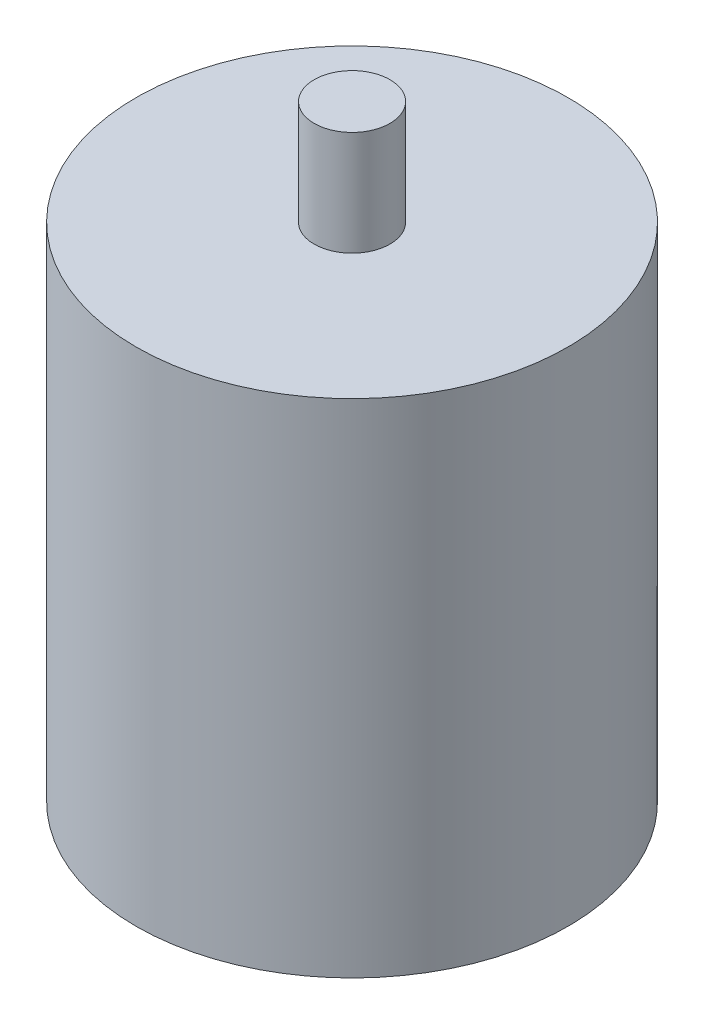
ISO-10303-21;
HEADER;
FILE_DESCRIPTION(('STEP AP214'),'2;1');
FILE_NAME('part.step','',(''),(''),'','','');
FILE_SCHEMA(('AUTOMOTIVE_DESIGN { 1 0 10303 214 1 1 1 1 }'));
ENDSEC;
DATA;
#1=APPLICATION_CONTEXT('core data for automotive mechanical design processes');
#2=APPLICATION_PROTOCOL_DEFINITION('international standard','automotive_design',2000,#1);
#3=PRODUCT_CONTEXT('',#1,'mechanical');
#4=PRODUCT('Part','Part','',(#3));
#5=PRODUCT_RELATED_PRODUCT_CATEGORY('part','',(#4));
#6=PRODUCT_DEFINITION_FORMATION('','',#4);
#7=PRODUCT_DEFINITION_CONTEXT('part definition',#1,'design');
#8=PRODUCT_DEFINITION('design','',#6,#7);
#9=PRODUCT_DEFINITION_SHAPE('','',#8);
#10=(LENGTH_UNIT() NAMED_UNIT(*) SI_UNIT(.MILLI.,.METRE.));
#11=(NAMED_UNIT(*) PLANE_ANGLE_UNIT() SI_UNIT($,.RADIAN.));
#12=(NAMED_UNIT(*) SI_UNIT($,.STERADIAN.) SOLID_ANGLE_UNIT());
#13=UNCERTAINTY_MEASURE_WITH_UNIT(LENGTH_MEASURE(1.E-05),#10,'distance_accuracy_value','');
#14=(GEOMETRIC_REPRESENTATION_CONTEXT(3) GLOBAL_UNCERTAINTY_ASSIGNED_CONTEXT((#13)) GLOBAL_UNIT_ASSIGNED_CONTEXT((#10,
#11,#12)) REPRESENTATION_CONTEXT('',''));
#15=CARTESIAN_POINT('',(0.,0.,0.));
#16=DIRECTION('',(0.,0.,1.));
#17=DIRECTION('',(1.,0.,0.));
#18=AXIS2_PLACEMENT_3D('',#15,#16,#17);
#19=CARTESIAN_POINT('',(0.,33.1,0.));
#20=DIRECTION('',(0.,-1.,0.));
#21=DIRECTION('',(0.,0.,-1.));
#22=AXIS2_PLACEMENT_3D('',#19,#20,#21);
#23=CYLINDRICAL_SURFACE('',#22,14.25);
#24=CARTESIAN_POINT('',(0.,33.1,0.));
#25=DIRECTION('',(0.,1.,0.));
#26=DIRECTION('',(0.,0.,1.));
#27=AXIS2_PLACEMENT_3D('',#24,#25,#26);
#28=CIRCLE('',#27,14.25);
#29=CARTESIAN_POINT('',(0.,33.1,14.25));
#30=VERTEX_POINT('',#29);
#31=EDGE_CURVE('E10',#30,#30,#28,.T.);
#32=ORIENTED_EDGE('',*,*,#31,.F.);
#33=EDGE_LOOP('',(#32));
#34=FACE_BOUND('',#33,.T.);
#35=CARTESIAN_POINT('',(0.,0.,0.));
#36=DIRECTION('',(0.,1.,0.));
#37=DIRECTION('',(0.,0.,1.));
#38=AXIS2_PLACEMENT_3D('',#35,#36,#37);
#39=CIRCLE('',#38,14.25);
#40=CARTESIAN_POINT('',(0.,0.,14.25));
#41=VERTEX_POINT('',#40);
#42=EDGE_CURVE('E37',#41,#41,#39,.T.);
#43=ORIENTED_EDGE('',*,*,#42,.T.);
#44=EDGE_LOOP('',(#43));
#45=FACE_BOUND('',#44,.T.);
#46=ADVANCED_FACE('F40',(#34,#45),#23,.T.);
#47=CARTESIAN_POINT('',(0.,33.1,0.));
#48=DIRECTION('',(0.,1.,0.));
#49=DIRECTION('',(0.,0.,1.));
#50=AXIS2_PLACEMENT_3D('',#47,#48,#49);
#51=PLANE('',#50);
#52=CARTESIAN_POINT('',(0.,33.1,0.));
#53=DIRECTION('',(0.,1.,0.));
#54=DIRECTION('',(0.,0.,1.));
#55=AXIS2_PLACEMENT_3D('',#52,#53,#54);
#56=CIRCLE('',#55,2.5);
#57=CARTESIAN_POINT('',(0.,33.1,2.5));
#58=VERTEX_POINT('',#57);
#59=EDGE_CURVE('E50',#58,#58,#56,.F.);
#60=ORIENTED_EDGE('',*,*,#59,.T.);
#61=EDGE_LOOP('',(#60));
#62=FACE_BOUND('',#61,.T.);
#63=ORIENTED_EDGE('',*,*,#31,.T.);
#64=EDGE_LOOP('',(#63));
#65=FACE_BOUND('',#64,.T.);
#66=ADVANCED_FACE('F70',(#62,#65),#51,.T.);
#67=CARTESIAN_POINT('',(0.,0.,0.));
#68=DIRECTION('',(0.,1.,0.));
#69=DIRECTION('',(0.,0.,1.));
#70=AXIS2_PLACEMENT_3D('',#67,#68,#69);
#71=PLANE('',#70);
#72=ORIENTED_EDGE('',*,*,#42,.F.);
#73=EDGE_LOOP('',(#72));
#74=FACE_BOUND('',#73,.T.);
#75=ADVANCED_FACE('F56',(#74),#71,.F.);
#76=CARTESIAN_POINT('',(0.,40.,0.));
#77=DIRECTION('',(0.,-1.,0.));
#78=DIRECTION('',(0.,0.,-1.));
#79=AXIS2_PLACEMENT_3D('',#76,#77,#78);
#80=CYLINDRICAL_SURFACE('',#79,2.5);
#81=ORIENTED_EDGE('',*,*,#59,.F.);
#82=EDGE_LOOP('',(#81));
#83=FACE_BOUND('',#82,.T.);
#84=CARTESIAN_POINT('',(0.,40.,0.));
#85=DIRECTION('',(0.,1.,0.));
#86=DIRECTION('',(0.,0.,1.));
#87=AXIS2_PLACEMENT_3D('',#84,#85,#86);
#88=CIRCLE('',#87,2.5);
#89=CARTESIAN_POINT('',(0.,40.,2.5));
#90=VERTEX_POINT('',#89);
#91=EDGE_CURVE('E51',#90,#90,#88,.T.);
#92=ORIENTED_EDGE('',*,*,#91,.F.);
#93=EDGE_LOOP('',(#92));
#94=FACE_BOUND('',#93,.T.);
#95=ADVANCED_FACE('F60',(#83,#94),#80,.T.);
#96=CARTESIAN_POINT('',(0.,40.,0.));
#97=DIRECTION('',(0.,1.,0.));
#98=DIRECTION('',(0.,0.,1.));
#99=AXIS2_PLACEMENT_3D('',#96,#97,#98);
#100=PLANE('',#99);
#101=ORIENTED_EDGE('',*,*,#91,.T.);
#102=EDGE_LOOP('',(#101));
#103=FACE_BOUND('',#102,.T.);
#104=ADVANCED_FACE('F54',(#103),#100,.T.);
#105=CLOSED_SHELL('',(#46,#66,#75,#95,#104));
#106=MANIFOLD_SOLID_BREP('B2',#105);
#107=ADVANCED_BREP_SHAPE_REPRESENTATION('',(#18,#106),#14);
#108=SHAPE_DEFINITION_REPRESENTATION(#9,#107);
ENDSEC;
END-ISO-10303-21;
